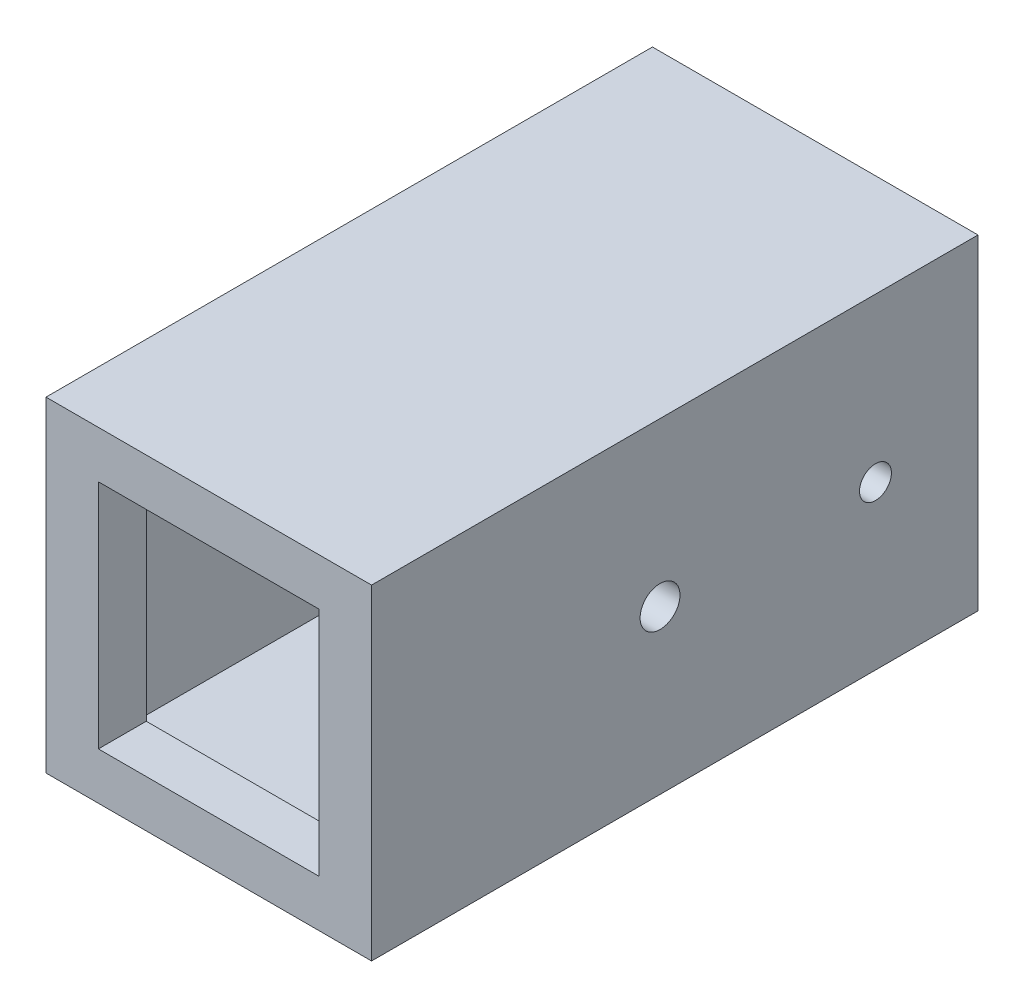
ISO-10303-21;
HEADER;
FILE_DESCRIPTION(('STEP AP214'),'2;1');
FILE_NAME('part.step','',(''),(''),'','','');
FILE_SCHEMA(('AUTOMOTIVE_DESIGN { 1 0 10303 214 1 1 1 1 }'));
ENDSEC;
DATA;
#1=APPLICATION_CONTEXT('core data for automotive mechanical design processes');
#2=APPLICATION_PROTOCOL_DEFINITION('international standard','automotive_design',2000,#1);
#3=PRODUCT_CONTEXT('',#1,'mechanical');
#4=PRODUCT('Part','Part','',(#3));
#5=PRODUCT_RELATED_PRODUCT_CATEGORY('part','',(#4));
#6=PRODUCT_DEFINITION_FORMATION('','',#4);
#7=PRODUCT_DEFINITION_CONTEXT('part definition',#1,'design');
#8=PRODUCT_DEFINITION('design','',#6,#7);
#9=PRODUCT_DEFINITION_SHAPE('','',#8);
#10=(LENGTH_UNIT() NAMED_UNIT(*) SI_UNIT(.MILLI.,.METRE.));
#11=(NAMED_UNIT(*) PLANE_ANGLE_UNIT() SI_UNIT($,.RADIAN.));
#12=(NAMED_UNIT(*) SI_UNIT($,.STERADIAN.) SOLID_ANGLE_UNIT());
#13=UNCERTAINTY_MEASURE_WITH_UNIT(LENGTH_MEASURE(1.E-05),#10,'distance_accuracy_value','');
#14=(GEOMETRIC_REPRESENTATION_CONTEXT(3) GLOBAL_UNCERTAINTY_ASSIGNED_CONTEXT((#13)) GLOBAL_UNIT_ASSIGNED_CONTEXT((#10,
#11,#12)) REPRESENTATION_CONTEXT('',''));
#15=CARTESIAN_POINT('',(0.,0.,0.));
#16=DIRECTION('',(0.,0.,1.));
#17=DIRECTION('',(1.,0.,0.));
#18=AXIS2_PLACEMENT_3D('',#15,#16,#17);
#19=CARTESIAN_POINT('',(10.2,-10.2,-35.));
#20=DIRECTION('',(1.,0.,0.));
#21=DIRECTION('',(0.,0.,-1.));
#22=AXIS2_PLACEMENT_3D('',#19,#20,#21);
#23=PLANE('',#22);
#24=CARTESIAN_POINT('',(10.2,0.,-15.075758146974));
#25=DIRECTION('',(1.,0.,0.));
#26=DIRECTION('',(0.,0.,-1.));
#27=AXIS2_PLACEMENT_3D('',#24,#25,#26);
#28=CIRCLE('',#27,1.25);
#29=CARTESIAN_POINT('',(10.2,0.,-16.325758146974));
#30=VERTEX_POINT('',#29);
#31=EDGE_CURVE('E279',#30,#30,#28,.T.);
#32=ORIENTED_EDGE('',*,*,#31,.F.);
#33=EDGE_LOOP('',(#32));
#34=FACE_BOUND('',#33,.T.);
#35=CARTESIAN_POINT('',(10.2,1.18542787272173E-13,-28.575758146974));
#36=DIRECTION('',(1.,0.,0.));
#37=DIRECTION('',(0.,0.,-1.));
#38=AXIS2_PLACEMENT_3D('',#35,#36,#37);
#39=CIRCLE('',#38,1.);
#40=CARTESIAN_POINT('',(10.2,1.18542787272173E-13,-29.575758146974));
#41=VERTEX_POINT('',#40);
#42=EDGE_CURVE('E274',#41,#41,#39,.T.);
#43=ORIENTED_EDGE('',*,*,#42,.F.);
#44=EDGE_LOOP('',(#43));
#45=FACE_BOUND('',#44,.T.);
#46=DIRECTION('',(0.,0.,1.));
#47=VECTOR('',#46,1.);
#48=CARTESIAN_POINT('',(10.2,10.2,-35.));
#49=LINE('',#48,#47);
#50=CARTESIAN_POINT('',(10.2,10.2,-35.));
#51=VERTEX_POINT('',#50);
#52=CARTESIAN_POINT('',(10.2,10.2,3.));
#53=VERTEX_POINT('',#52);
#54=EDGE_CURVE('E228',#51,#53,#49,.T.);
#55=ORIENTED_EDGE('',*,*,#54,.T.);
#56=DIRECTION('',(0.,1.,0.));
#57=VECTOR('',#56,1.);
#58=CARTESIAN_POINT('',(10.2,10.2,3.));
#59=LINE('',#58,#57);
#60=CARTESIAN_POINT('',(10.2,-10.2,3.));
#61=VERTEX_POINT('',#60);
#62=EDGE_CURVE('E159',#61,#53,#59,.T.);
#63=ORIENTED_EDGE('',*,*,#62,.F.);
#64=DIRECTION('',(0.,0.,1.));
#65=VECTOR('',#64,1.);
#66=CARTESIAN_POINT('',(10.2,-10.2,-35.));
#67=LINE('',#66,#65);
#68=CARTESIAN_POINT('',(10.2,-10.2,-35.));
#69=VERTEX_POINT('',#68);
#70=EDGE_CURVE('E229',#69,#61,#67,.T.);
#71=ORIENTED_EDGE('',*,*,#70,.F.);
#72=DIRECTION('',(0.,1.,0.));
#73=VECTOR('',#72,1.);
#74=CARTESIAN_POINT('',(10.2,-10.2,-35.));
#75=LINE('',#74,#73);
#76=EDGE_CURVE('E211',#69,#51,#75,.T.);
#77=ORIENTED_EDGE('',*,*,#76,.T.);
#78=EDGE_LOOP('',(#55,#63,#71,#77));
#79=FACE_BOUND('',#78,.T.);
#80=ADVANCED_FACE('F39',(#34,#45,#79),#23,.T.);
#81=CARTESIAN_POINT('',(-10.2,-10.2,-35.));
#82=DIRECTION('',(0.,-1.,0.));
#83=DIRECTION('',(0.,0.,-1.));
#84=AXIS2_PLACEMENT_3D('',#81,#82,#83);
#85=PLANE('',#84);
#86=ORIENTED_EDGE('',*,*,#70,.T.);
#87=DIRECTION('',(1.,0.,0.));
#88=VECTOR('',#87,1.);
#89=CARTESIAN_POINT('',(10.2,-10.2,3.));
#90=LINE('',#89,#88);
#91=CARTESIAN_POINT('',(-10.2,-10.2,3.));
#92=VERTEX_POINT('',#91);
#93=EDGE_CURVE('E193',#92,#61,#90,.T.);
#94=ORIENTED_EDGE('',*,*,#93,.F.);
#95=DIRECTION('',(0.,0.,1.));
#96=VECTOR('',#95,1.);
#97=CARTESIAN_POINT('',(-10.2,-10.2,-35.));
#98=LINE('',#97,#96);
#99=CARTESIAN_POINT('',(-10.2,-10.2,-35.));
#100=VERTEX_POINT('',#99);
#101=EDGE_CURVE('E232',#100,#92,#98,.T.);
#102=ORIENTED_EDGE('',*,*,#101,.F.);
#103=DIRECTION('',(1.,0.,0.));
#104=VECTOR('',#103,1.);
#105=CARTESIAN_POINT('',(-10.2,-10.2,-35.));
#106=LINE('',#105,#104);
#107=EDGE_CURVE('E225',#100,#69,#106,.T.);
#108=ORIENTED_EDGE('',*,*,#107,.T.);
#109=EDGE_LOOP('',(#86,#94,#102,#108));
#110=FACE_BOUND('',#109,.T.);
#111=ADVANCED_FACE('F309',(#110),#85,.T.);
#112=CARTESIAN_POINT('',(-10.2,-10.2,-35.));
#113=DIRECTION('',(-1.,0.,0.));
#114=DIRECTION('',(0.,0.,1.));
#115=AXIS2_PLACEMENT_3D('',#112,#113,#114);
#116=PLANE('',#115);
#117=CARTESIAN_POINT('',(-10.2,0.,-15.075758146974));
#118=DIRECTION('',(1.,0.,0.));
#119=DIRECTION('',(0.,0.,-1.));
#120=AXIS2_PLACEMENT_3D('',#117,#118,#119);
#121=CIRCLE('',#120,1.25);
#122=CARTESIAN_POINT('',(-10.2,0.,-16.325758146974));
#123=VERTEX_POINT('',#122);
#124=EDGE_CURVE('E241',#123,#123,#121,.T.);
#125=ORIENTED_EDGE('',*,*,#124,.T.);
#126=EDGE_LOOP('',(#125));
#127=FACE_BOUND('',#126,.T.);
#128=CARTESIAN_POINT('',(-10.2,1.18542787272173E-13,-28.575758146974));
#129=DIRECTION('',(1.,0.,0.));
#130=DIRECTION('',(0.,0.,-1.));
#131=AXIS2_PLACEMENT_3D('',#128,#129,#130);
#132=CIRCLE('',#131,1.);
#133=CARTESIAN_POINT('',(-10.2,1.18542787272173E-13,-29.575758146974));
#134=VERTEX_POINT('',#133);
#135=EDGE_CURVE('E269',#134,#134,#132,.T.);
#136=ORIENTED_EDGE('',*,*,#135,.T.);
#137=EDGE_LOOP('',(#136));
#138=FACE_BOUND('',#137,.T.);
#139=ORIENTED_EDGE('',*,*,#101,.T.);
#140=DIRECTION('',(0.,-1.,0.));
#141=VECTOR('',#140,1.);
#142=CARTESIAN_POINT('',(-10.2,10.2,3.));
#143=LINE('',#142,#141);
#144=CARTESIAN_POINT('',(-10.2,10.2,3.));
#145=VERTEX_POINT('',#144);
#146=EDGE_CURVE('E190',#145,#92,#143,.T.);
#147=ORIENTED_EDGE('',*,*,#146,.F.);
#148=DIRECTION('',(0.,0.,1.));
#149=VECTOR('',#148,1.);
#150=CARTESIAN_POINT('',(-10.2,10.2,-35.));
#151=LINE('',#150,#149);
#152=CARTESIAN_POINT('',(-10.2,10.2,-35.));
#153=VERTEX_POINT('',#152);
#154=EDGE_CURVE('E234',#153,#145,#151,.T.);
#155=ORIENTED_EDGE('',*,*,#154,.F.);
#156=DIRECTION('',(0.,-1.,0.));
#157=VECTOR('',#156,1.);
#158=CARTESIAN_POINT('',(-10.2,-10.2,-35.));
#159=LINE('',#158,#157);
#160=EDGE_CURVE('E222',#153,#100,#159,.T.);
#161=ORIENTED_EDGE('',*,*,#160,.T.);
#162=EDGE_LOOP('',(#139,#147,#155,#161));
#163=FACE_BOUND('',#162,.T.);
#164=ADVANCED_FACE('F315',(#127,#138,#163),#116,.T.);
#165=CARTESIAN_POINT('',(-10.2,10.2,-35.));
#166=DIRECTION('',(0.,1.,0.));
#167=DIRECTION('',(0.,0.,1.));
#168=AXIS2_PLACEMENT_3D('',#165,#166,#167);
#169=PLANE('',#168);
#170=ORIENTED_EDGE('',*,*,#154,.T.);
#171=DIRECTION('',(-1.,0.,0.));
#172=VECTOR('',#171,1.);
#173=CARTESIAN_POINT('',(10.2,10.2,3.));
#174=LINE('',#173,#172);
#175=EDGE_CURVE('E187',#53,#145,#174,.T.);
#176=ORIENTED_EDGE('',*,*,#175,.F.);
#177=ORIENTED_EDGE('',*,*,#54,.F.);
#178=DIRECTION('',(-1.,0.,0.));
#179=VECTOR('',#178,1.);
#180=CARTESIAN_POINT('',(-10.2,10.2,-35.));
#181=LINE('',#180,#179);
#182=EDGE_CURVE('E219',#51,#153,#181,.T.);
#183=ORIENTED_EDGE('',*,*,#182,.T.);
#184=EDGE_LOOP('',(#170,#176,#177,#183));
#185=FACE_BOUND('',#184,.T.);
#186=ADVANCED_FACE('F322',(#185),#169,.T.);
#187=CARTESIAN_POINT('',(0.,0.,-35.));
#188=DIRECTION('',(0.,0.,-1.));
#189=DIRECTION('',(-1.,0.,0.));
#190=AXIS2_PLACEMENT_3D('',#187,#188,#189);
#191=PLANE('',#190);
#192=DIRECTION('',(-1.,0.,0.));
#193=VECTOR('',#192,1.);
#194=CARTESIAN_POINT('',(-8.2,9.2,-35.));
#195=LINE('',#194,#193);
#196=CARTESIAN_POINT('',(9.2,9.2,-35.));
#197=VERTEX_POINT('',#196);
#198=CARTESIAN_POINT('',(-9.2,9.2,-35.));
#199=VERTEX_POINT('',#198);
#200=EDGE_CURVE('E231',#197,#199,#195,.T.);
#201=ORIENTED_EDGE('',*,*,#200,.T.);
#202=DIRECTION('',(0.,-1.,0.));
#203=VECTOR('',#202,1.);
#204=CARTESIAN_POINT('',(-9.2,-8.2,-35.));
#205=LINE('',#204,#203);
#206=CARTESIAN_POINT('',(-9.2,-9.2,-35.));
#207=VERTEX_POINT('',#206);
#208=EDGE_CURVE('E250',#199,#207,#205,.T.);
#209=ORIENTED_EDGE('',*,*,#208,.T.);
#210=DIRECTION('',(1.,0.,0.));
#211=VECTOR('',#210,1.);
#212=CARTESIAN_POINT('',(8.2,-9.2,-35.));
#213=LINE('',#212,#211);
#214=CARTESIAN_POINT('',(9.2,-9.2,-35.));
#215=VERTEX_POINT('',#214);
#216=EDGE_CURVE('E248',#207,#215,#213,.T.);
#217=ORIENTED_EDGE('',*,*,#216,.T.);
#218=DIRECTION('',(0.,1.,0.));
#219=VECTOR('',#218,1.);
#220=CARTESIAN_POINT('',(9.2,8.2,-35.));
#221=LINE('',#220,#219);
#222=EDGE_CURVE('E246',#215,#197,#221,.T.);
#223=ORIENTED_EDGE('',*,*,#222,.T.);
#224=EDGE_LOOP('',(#201,#209,#217,#223));
#225=FACE_BOUND('',#224,.T.);
#226=ORIENTED_EDGE('',*,*,#76,.F.);
#227=ORIENTED_EDGE('',*,*,#107,.F.);
#228=ORIENTED_EDGE('',*,*,#160,.F.);
#229=ORIENTED_EDGE('',*,*,#182,.F.);
#230=EDGE_LOOP('',(#226,#227,#228,#229));
#231=FACE_BOUND('',#230,.T.);
#232=ADVANCED_FACE('F465',(#225,#231),#191,.T.);
#233=CARTESIAN_POINT('',(8.2,-8.2,-35.));
#234=DIRECTION('',(1.,0.,0.));
#235=DIRECTION('',(0.,0.,-1.));
#236=AXIS2_PLACEMENT_3D('',#233,#234,#235);
#237=PLANE('',#236);
#238=CARTESIAN_POINT('',(8.19999999999999,0.,-15.075758146974));
#239=DIRECTION('',(1.,0.,0.));
#240=DIRECTION('',(0.,0.,-1.));
#241=AXIS2_PLACEMENT_3D('',#238,#239,#240);
#242=CIRCLE('',#241,1.25);
#243=CARTESIAN_POINT('',(8.19999999999999,0.,-16.325758146974));
#244=VERTEX_POINT('',#243);
#245=EDGE_CURVE('E174',#244,#244,#242,.T.);
#246=ORIENTED_EDGE('',*,*,#245,.T.);
#247=EDGE_LOOP('',(#246));
#248=FACE_BOUND('',#247,.T.);
#249=CARTESIAN_POINT('',(8.19999999999999,1.18542787272173E-13,-28.575758146974));
#250=DIRECTION('',(1.,0.,0.));
#251=DIRECTION('',(0.,0.,-1.));
#252=AXIS2_PLACEMENT_3D('',#249,#250,#251);
#253=CIRCLE('',#252,1.);
#254=CARTESIAN_POINT('',(8.19999999999999,1.18542787272173E-13,-29.575758146974));
#255=VERTEX_POINT('',#254);
#256=EDGE_CURVE('E240',#255,#255,#253,.T.);
#257=ORIENTED_EDGE('',*,*,#256,.T.);
#258=EDGE_LOOP('',(#257));
#259=FACE_BOUND('',#258,.T.);
#260=DIRECTION('',(0.,0.,1.));
#261=VECTOR('',#260,1.);
#262=CARTESIAN_POINT('',(8.2,8.2,-35.));
#263=LINE('',#262,#261);
#264=CARTESIAN_POINT('',(8.2,8.2,-34.));
#265=VERTEX_POINT('',#264);
#266=CARTESIAN_POINT('',(8.2,8.2,0.));
#267=VERTEX_POINT('',#266);
#268=EDGE_CURVE('E208',#265,#267,#263,.T.);
#269=ORIENTED_EDGE('',*,*,#268,.F.);
#270=DIRECTION('',(0.,1.,0.));
#271=VECTOR('',#270,1.);
#272=CARTESIAN_POINT('',(8.2,-8.2,-34.));
#273=LINE('',#272,#271);
#274=CARTESIAN_POINT('',(8.2,-8.2,-34.));
#275=VERTEX_POINT('',#274);
#276=EDGE_CURVE('E48',#265,#275,#273,.F.);
#277=ORIENTED_EDGE('',*,*,#276,.T.);
#278=DIRECTION('',(0.,0.,1.));
#279=VECTOR('',#278,1.);
#280=CARTESIAN_POINT('',(8.2,-8.2,-35.));
#281=LINE('',#280,#279);
#282=CARTESIAN_POINT('',(8.2,-8.2,0.));
#283=VERTEX_POINT('',#282);
#284=EDGE_CURVE('E209',#275,#283,#281,.T.);
#285=ORIENTED_EDGE('',*,*,#284,.T.);
#286=DIRECTION('',(0.,1.,0.));
#287=VECTOR('',#286,1.);
#288=CARTESIAN_POINT('',(8.2,-8.2,0.));
#289=LINE('',#288,#287);
#290=EDGE_CURVE('E196',#283,#267,#289,.T.);
#291=ORIENTED_EDGE('',*,*,#290,.T.);
#292=EDGE_LOOP('',(#269,#277,#285,#291));
#293=FACE_BOUND('',#292,.T.);
#294=ADVANCED_FACE('F287',(#248,#259,#293),#237,.F.);
#295=CARTESIAN_POINT('',(-8.2,-8.2,-35.));
#296=DIRECTION('',(0.,-1.,0.));
#297=DIRECTION('',(0.,0.,-1.));
#298=AXIS2_PLACEMENT_3D('',#295,#296,#297);
#299=PLANE('',#298);
#300=ORIENTED_EDGE('',*,*,#284,.F.);
#301=DIRECTION('',(1.,0.,0.));
#302=VECTOR('',#301,1.);
#303=CARTESIAN_POINT('',(-8.2,-8.2,-34.));
#304=LINE('',#303,#302);
#305=CARTESIAN_POINT('',(-8.2,-8.2,-34.));
#306=VERTEX_POINT('',#305);
#307=EDGE_CURVE('E256',#275,#306,#304,.F.);
#308=ORIENTED_EDGE('',*,*,#307,.T.);
#309=DIRECTION('',(0.,0.,1.));
#310=VECTOR('',#309,1.);
#311=CARTESIAN_POINT('',(-8.2,-8.2,-35.));
#312=LINE('',#311,#310);
#313=CARTESIAN_POINT('',(-8.2,-8.2,0.));
#314=VERTEX_POINT('',#313);
#315=EDGE_CURVE('E212',#306,#314,#312,.T.);
#316=ORIENTED_EDGE('',*,*,#315,.T.);
#317=DIRECTION('',(1.,0.,0.));
#318=VECTOR('',#317,1.);
#319=CARTESIAN_POINT('',(-8.2,-8.2,0.));
#320=LINE('',#319,#318);
#321=EDGE_CURVE('E205',#314,#283,#320,.T.);
#322=ORIENTED_EDGE('',*,*,#321,.T.);
#323=EDGE_LOOP('',(#300,#308,#316,#322));
#324=FACE_BOUND('',#323,.T.);
#325=ADVANCED_FACE('F513',(#324),#299,.F.);
#326=CARTESIAN_POINT('',(-8.2,-8.2,-35.));
#327=DIRECTION('',(-1.,0.,0.));
#328=DIRECTION('',(0.,0.,1.));
#329=AXIS2_PLACEMENT_3D('',#326,#327,#328);
#330=PLANE('',#329);
#331=CARTESIAN_POINT('',(-8.2,0.,-15.075758146974));
#332=DIRECTION('',(-1.,0.,0.));
#333=DIRECTION('',(0.,0.,1.));
#334=AXIS2_PLACEMENT_3D('',#331,#332,#333);
#335=CIRCLE('',#334,1.25);
#336=CARTESIAN_POINT('',(-8.2,0.,-13.825758146974));
#337=VERTEX_POINT('',#336);
#338=EDGE_CURVE('E242',#337,#337,#335,.T.);
#339=ORIENTED_EDGE('',*,*,#338,.T.);
#340=EDGE_LOOP('',(#339));
#341=FACE_BOUND('',#340,.T.);
#342=CARTESIAN_POINT('',(-8.2,1.18542787272173E-13,-28.575758146974));
#343=DIRECTION('',(-1.,0.,0.));
#344=DIRECTION('',(0.,0.,1.));
#345=AXIS2_PLACEMENT_3D('',#342,#343,#344);
#346=CIRCLE('',#345,1.);
#347=CARTESIAN_POINT('',(-8.2,1.18542787272173E-13,-27.575758146974));
#348=VERTEX_POINT('',#347);
#349=EDGE_CURVE('E237',#348,#348,#346,.T.);
#350=ORIENTED_EDGE('',*,*,#349,.T.);
#351=EDGE_LOOP('',(#350));
#352=FACE_BOUND('',#351,.T.);
#353=ORIENTED_EDGE('',*,*,#315,.F.);
#354=DIRECTION('',(0.,-1.,0.));
#355=VECTOR('',#354,1.);
#356=CARTESIAN_POINT('',(-8.2,8.2,-34.));
#357=LINE('',#356,#355);
#358=CARTESIAN_POINT('',(-8.2,8.2,-34.));
#359=VERTEX_POINT('',#358);
#360=EDGE_CURVE('E253',#306,#359,#357,.F.);
#361=ORIENTED_EDGE('',*,*,#360,.T.);
#362=DIRECTION('',(0.,0.,1.));
#363=VECTOR('',#362,1.);
#364=CARTESIAN_POINT('',(-8.2,8.2,-35.));
#365=LINE('',#364,#363);
#366=CARTESIAN_POINT('',(-8.2,8.2,0.));
#367=VERTEX_POINT('',#366);
#368=EDGE_CURVE('E214',#359,#367,#365,.T.);
#369=ORIENTED_EDGE('',*,*,#368,.T.);
#370=DIRECTION('',(0.,-1.,0.));
#371=VECTOR('',#370,1.);
#372=CARTESIAN_POINT('',(-8.2,-8.2,0.));
#373=LINE('',#372,#371);
#374=EDGE_CURVE('E202',#367,#314,#373,.T.);
#375=ORIENTED_EDGE('',*,*,#374,.T.);
#376=EDGE_LOOP('',(#353,#361,#369,#375));
#377=FACE_BOUND('',#376,.T.);
#378=ADVANCED_FACE('F503',(#341,#352,#377),#330,.F.);
#379=CARTESIAN_POINT('',(-8.2,8.2,-35.));
#380=DIRECTION('',(0.,1.,0.));
#381=DIRECTION('',(0.,0.,1.));
#382=AXIS2_PLACEMENT_3D('',#379,#380,#381);
#383=PLANE('',#382);
#384=ORIENTED_EDGE('',*,*,#368,.F.);
#385=DIRECTION('',(-1.,0.,0.));
#386=VECTOR('',#385,1.);
#387=CARTESIAN_POINT('',(8.2,8.2,-34.));
#388=LINE('',#387,#386);
#389=EDGE_CURVE('E11',#359,#265,#388,.F.);
#390=ORIENTED_EDGE('',*,*,#389,.T.);
#391=ORIENTED_EDGE('',*,*,#268,.T.);
#392=DIRECTION('',(-1.,0.,0.));
#393=VECTOR('',#392,1.);
#394=CARTESIAN_POINT('',(-8.2,8.2,0.));
#395=LINE('',#394,#393);
#396=EDGE_CURVE('E199',#267,#367,#395,.T.);
#397=ORIENTED_EDGE('',*,*,#396,.T.);
#398=EDGE_LOOP('',(#384,#390,#391,#397));
#399=FACE_BOUND('',#398,.T.);
#400=ADVANCED_FACE('F453',(#399),#383,.F.);
#401=CARTESIAN_POINT('',(0.,0.,0.));
#402=DIRECTION('',(0.,0.,-1.));
#403=DIRECTION('',(-1.,0.,0.));
#404=AXIS2_PLACEMENT_3D('',#401,#402,#403);
#405=PLANE('',#404);
#406=DIRECTION('',(-1.,0.,0.));
#407=VECTOR('',#406,1.);
#408=CARTESIAN_POINT('',(6.9173511930245,7.24862700945783,0.));
#409=LINE('',#408,#407);
#410=CARTESIAN_POINT('',(6.9173511930245,7.24862700945783,0.));
#411=VERTEX_POINT('',#410);
#412=CARTESIAN_POINT('',(-6.9173511930245,7.24862700945783,0.));
#413=VERTEX_POINT('',#412);
#414=EDGE_CURVE('E152',#411,#413,#409,.T.);
#415=ORIENTED_EDGE('',*,*,#414,.T.);
#416=DIRECTION('',(0.,-1.,0.));
#417=VECTOR('',#416,1.);
#418=CARTESIAN_POINT('',(-6.9173511930245,-7.24862700945783,0.));
#419=LINE('',#418,#417);
#420=CARTESIAN_POINT('',(-6.9173511930245,-7.24862700945783,0.));
#421=VERTEX_POINT('',#420);
#422=EDGE_CURVE('E172',#413,#421,#419,.T.);
#423=ORIENTED_EDGE('',*,*,#422,.T.);
#424=DIRECTION('',(1.,0.,0.));
#425=VECTOR('',#424,1.);
#426=CARTESIAN_POINT('',(6.9173511930245,-7.24862700945783,0.));
#427=LINE('',#426,#425);
#428=CARTESIAN_POINT('',(6.9173511930245,-7.24862700945783,0.));
#429=VERTEX_POINT('',#428);
#430=EDGE_CURVE('E158',#421,#429,#427,.T.);
#431=ORIENTED_EDGE('',*,*,#430,.T.);
#432=DIRECTION('',(0.,1.,0.));
#433=VECTOR('',#432,1.);
#434=CARTESIAN_POINT('',(6.9173511930245,-7.24862700945783,0.));
#435=LINE('',#434,#433);
#436=EDGE_CURVE('E176',#429,#411,#435,.T.);
#437=ORIENTED_EDGE('',*,*,#436,.T.);
#438=EDGE_LOOP('',(#415,#423,#431,#437));
#439=FACE_BOUND('',#438,.T.);
#440=ORIENTED_EDGE('',*,*,#396,.F.);
#441=ORIENTED_EDGE('',*,*,#290,.F.);
#442=ORIENTED_EDGE('',*,*,#321,.F.);
#443=ORIENTED_EDGE('',*,*,#374,.F.);
#444=EDGE_LOOP('',(#440,#441,#442,#443));
#445=FACE_BOUND('',#444,.T.);
#446=ADVANCED_FACE('F442',(#439,#445),#405,.T.);
#447=CARTESIAN_POINT('',(0.,0.,3.));
#448=DIRECTION('',(0.,0.,-1.));
#449=DIRECTION('',(-1.,0.,0.));
#450=AXIS2_PLACEMENT_3D('',#447,#448,#449);
#451=PLANE('',#450);
#452=ORIENTED_EDGE('',*,*,#62,.T.);
#453=ORIENTED_EDGE('',*,*,#175,.T.);
#454=ORIENTED_EDGE('',*,*,#146,.T.);
#455=ORIENTED_EDGE('',*,*,#93,.T.);
#456=EDGE_LOOP('',(#452,#453,#454,#455));
#457=FACE_BOUND('',#456,.T.);
#458=DIRECTION('',(0.,-1.,0.));
#459=VECTOR('',#458,1.);
#460=CARTESIAN_POINT('',(-6.9173511930245,-7.24862700945783,3.));
#461=LINE('',#460,#459);
#462=CARTESIAN_POINT('',(-6.9173511930245,7.24862700945783,3.));
#463=VERTEX_POINT('',#462);
#464=CARTESIAN_POINT('',(-6.9173511930245,-7.24862700945783,3.));
#465=VERTEX_POINT('',#464);
#466=EDGE_CURVE('E141',#463,#465,#461,.T.);
#467=ORIENTED_EDGE('',*,*,#466,.F.);
#468=DIRECTION('',(-1.,0.,0.));
#469=VECTOR('',#468,1.);
#470=CARTESIAN_POINT('',(6.9173511930245,7.24862700945783,3.));
#471=LINE('',#470,#469);
#472=CARTESIAN_POINT('',(6.9173511930245,7.24862700945783,3.));
#473=VERTEX_POINT('',#472);
#474=EDGE_CURVE('E167',#473,#463,#471,.T.);
#475=ORIENTED_EDGE('',*,*,#474,.F.);
#476=DIRECTION('',(0.,1.,0.));
#477=VECTOR('',#476,1.);
#478=CARTESIAN_POINT('',(6.9173511930245,-7.24862700945783,3.));
#479=LINE('',#478,#477);
#480=CARTESIAN_POINT('',(6.9173511930245,-7.24862700945783,3.));
#481=VERTEX_POINT('',#480);
#482=EDGE_CURVE('E165',#481,#473,#479,.T.);
#483=ORIENTED_EDGE('',*,*,#482,.F.);
#484=DIRECTION('',(1.,0.,0.));
#485=VECTOR('',#484,1.);
#486=CARTESIAN_POINT('',(6.9173511930245,-7.24862700945783,3.));
#487=LINE('',#486,#485);
#488=EDGE_CURVE('E151',#465,#481,#487,.T.);
#489=ORIENTED_EDGE('',*,*,#488,.F.);
#490=EDGE_LOOP('',(#467,#475,#483,#489));
#491=FACE_BOUND('',#490,.T.);
#492=ADVANCED_FACE('F163',(#457,#491),#451,.F.);
#493=CARTESIAN_POINT('',(-6.9173511930245,-7.24862700945783,3.));
#494=DIRECTION('',(1.,0.,0.));
#495=DIRECTION('',(0.,0.,-1.));
#496=AXIS2_PLACEMENT_3D('',#493,#494,#495);
#497=PLANE('',#496);
#498=ORIENTED_EDGE('',*,*,#422,.F.);
#499=DIRECTION('',(0.,0.,-1.));
#500=VECTOR('',#499,1.);
#501=CARTESIAN_POINT('',(-6.9173511930245,7.24862700945783,3.));
#502=LINE('',#501,#500);
#503=EDGE_CURVE('E147',#463,#413,#502,.T.);
#504=ORIENTED_EDGE('',*,*,#503,.F.);
#505=ORIENTED_EDGE('',*,*,#466,.T.);
#506=DIRECTION('',(0.,0.,-1.));
#507=VECTOR('',#506,1.);
#508=CARTESIAN_POINT('',(-6.9173511930245,-7.24862700945783,3.));
#509=LINE('',#508,#507);
#510=EDGE_CURVE('E144',#465,#421,#509,.T.);
#511=ORIENTED_EDGE('',*,*,#510,.T.);
#512=EDGE_LOOP('',(#498,#504,#505,#511));
#513=FACE_BOUND('',#512,.T.);
#514=ADVANCED_FACE('F143',(#513),#497,.T.);
#515=CARTESIAN_POINT('',(6.9173511930245,-7.24862700945783,3.));
#516=DIRECTION('',(0.,1.,0.));
#517=DIRECTION('',(0.,0.,1.));
#518=AXIS2_PLACEMENT_3D('',#515,#516,#517);
#519=PLANE('',#518);
#520=ORIENTED_EDGE('',*,*,#430,.F.);
#521=ORIENTED_EDGE('',*,*,#510,.F.);
#522=ORIENTED_EDGE('',*,*,#488,.T.);
#523=DIRECTION('',(0.,0.,-1.));
#524=VECTOR('',#523,1.);
#525=CARTESIAN_POINT('',(6.9173511930245,-7.24862700945783,3.));
#526=LINE('',#525,#524);
#527=EDGE_CURVE('E160',#481,#429,#526,.T.);
#528=ORIENTED_EDGE('',*,*,#527,.T.);
#529=EDGE_LOOP('',(#520,#521,#522,#528));
#530=FACE_BOUND('',#529,.T.);
#531=ADVANCED_FACE('F155',(#530),#519,.T.);
#532=CARTESIAN_POINT('',(6.9173511930245,-7.24862700945783,3.));
#533=DIRECTION('',(-1.,0.,0.));
#534=DIRECTION('',(0.,0.,1.));
#535=AXIS2_PLACEMENT_3D('',#532,#533,#534);
#536=PLANE('',#535);
#537=ORIENTED_EDGE('',*,*,#436,.F.);
#538=ORIENTED_EDGE('',*,*,#527,.F.);
#539=ORIENTED_EDGE('',*,*,#482,.T.);
#540=DIRECTION('',(0.,0.,-1.));
#541=VECTOR('',#540,1.);
#542=CARTESIAN_POINT('',(6.9173511930245,7.24862700945783,3.));
#543=LINE('',#542,#541);
#544=EDGE_CURVE('E182',#473,#411,#543,.T.);
#545=ORIENTED_EDGE('',*,*,#544,.T.);
#546=EDGE_LOOP('',(#537,#538,#539,#545));
#547=FACE_BOUND('',#546,.T.);
#548=ADVANCED_FACE('F403',(#547),#536,.T.);
#549=CARTESIAN_POINT('',(6.9173511930245,7.24862700945783,3.));
#550=DIRECTION('',(0.,-1.,0.));
#551=DIRECTION('',(0.,0.,-1.));
#552=AXIS2_PLACEMENT_3D('',#549,#550,#551);
#553=PLANE('',#552);
#554=ORIENTED_EDGE('',*,*,#414,.F.);
#555=ORIENTED_EDGE('',*,*,#544,.F.);
#556=ORIENTED_EDGE('',*,*,#474,.T.);
#557=ORIENTED_EDGE('',*,*,#503,.T.);
#558=EDGE_LOOP('',(#554,#555,#556,#557));
#559=FACE_BOUND('',#558,.T.);
#560=ADVANCED_FACE('F392',(#559),#553,.T.);
#561=CARTESIAN_POINT('',(-10.2,1.18542787272173E-13,-28.575758146974));
#562=DIRECTION('',(1.,0.,0.));
#563=DIRECTION('',(0.,0.,-1.));
#564=AXIS2_PLACEMENT_3D('',#561,#562,#563);
#565=CYLINDRICAL_SURFACE('',#564,1.);
#566=ORIENTED_EDGE('',*,*,#135,.F.);
#567=EDGE_LOOP('',(#566));
#568=FACE_BOUND('',#567,.T.);
#569=ORIENTED_EDGE('',*,*,#349,.F.);
#570=EDGE_LOOP('',(#569));
#571=FACE_BOUND('',#570,.T.);
#572=ADVANCED_FACE('F304',(#568,#571),#565,.F.);
#573=CARTESIAN_POINT('',(-10.2,0.,-15.075758146974));
#574=DIRECTION('',(1.,0.,0.));
#575=DIRECTION('',(0.,0.,-1.));
#576=AXIS2_PLACEMENT_3D('',#573,#574,#575);
#577=CYLINDRICAL_SURFACE('',#576,1.25);
#578=ORIENTED_EDGE('',*,*,#124,.F.);
#579=EDGE_LOOP('',(#578));
#580=FACE_BOUND('',#579,.T.);
#581=ORIENTED_EDGE('',*,*,#338,.F.);
#582=EDGE_LOOP('',(#581));
#583=FACE_BOUND('',#582,.T.);
#584=ADVANCED_FACE('F295',(#580,#583),#577,.F.);
#585=ORIENTED_EDGE('',*,*,#42,.T.);
#586=EDGE_LOOP('',(#585));
#587=FACE_BOUND('',#586,.T.);
#588=ORIENTED_EDGE('',*,*,#256,.F.);
#589=EDGE_LOOP('',(#588));
#590=FACE_BOUND('',#589,.T.);
#591=ADVANCED_FACE('F292',(#587,#590),#565,.F.);
#592=ORIENTED_EDGE('',*,*,#31,.T.);
#593=EDGE_LOOP('',(#592));
#594=FACE_BOUND('',#593,.T.);
#595=ORIENTED_EDGE('',*,*,#245,.F.);
#596=EDGE_LOOP('',(#595));
#597=FACE_BOUND('',#596,.T.);
#598=ADVANCED_FACE('F290',(#594,#597),#577,.F.);
#599=CARTESIAN_POINT('',(9.2,0.,-34.));
#600=DIRECTION('',(0.,-1.,0.));
#601=DIRECTION('',(0.,0.,-1.));
#602=AXIS2_PLACEMENT_3D('',#599,#600,#601);
#603=CYLINDRICAL_SURFACE('',#602,1.);
#604=CARTESIAN_POINT('',(9.2,-9.2,-34.));
#605=DIRECTION('',(-0.707106781186547,-0.707106781186547,0.));
#606=DIRECTION('',(-0.707106781186547,0.707106781186547,0.));
#607=AXIS2_PLACEMENT_3D('',#604,#605,#606);
#608=ELLIPSE('',#607,1.41421356237309,1.);
#609=EDGE_CURVE('E262',#275,#215,#608,.T.);
#610=ORIENTED_EDGE('',*,*,#609,.F.);
#611=ORIENTED_EDGE('',*,*,#276,.F.);
#612=CARTESIAN_POINT('',(9.2,9.2,-34.));
#613=DIRECTION('',(0.707106781186547,-0.707106781186547,0.));
#614=DIRECTION('',(-0.707106781186547,-0.707106781186547,0.));
#615=AXIS2_PLACEMENT_3D('',#612,#613,#614);
#616=ELLIPSE('',#615,1.41421356237309,1.);
#617=EDGE_CURVE('E43',#197,#265,#616,.F.);
#618=ORIENTED_EDGE('',*,*,#617,.F.);
#619=ORIENTED_EDGE('',*,*,#222,.F.);
#620=EDGE_LOOP('',(#610,#611,#618,#619));
#621=FACE_BOUND('',#620,.T.);
#622=ADVANCED_FACE('F41',(#621),#603,.T.);
#623=CARTESIAN_POINT('',(0.,9.2,-34.));
#624=DIRECTION('',(1.,0.,0.));
#625=DIRECTION('',(0.,0.,-1.));
#626=AXIS2_PLACEMENT_3D('',#623,#624,#625);
#627=CYLINDRICAL_SURFACE('',#626,1.);
#628=ORIENTED_EDGE('',*,*,#617,.T.);
#629=ORIENTED_EDGE('',*,*,#389,.F.);
#630=CARTESIAN_POINT('',(-9.2,9.2,-34.));
#631=DIRECTION('',(0.707106781186547,0.707106781186547,0.));
#632=DIRECTION('',(-0.707106781186547,0.707106781186547,0.));
#633=AXIS2_PLACEMENT_3D('',#630,#631,#632);
#634=ELLIPSE('',#633,1.41421356237309,1.);
#635=EDGE_CURVE('E261',#199,#359,#634,.F.);
#636=ORIENTED_EDGE('',*,*,#635,.F.);
#637=ORIENTED_EDGE('',*,*,#200,.F.);
#638=EDGE_LOOP('',(#628,#629,#636,#637));
#639=FACE_BOUND('',#638,.T.);
#640=ADVANCED_FACE('F300',(#639),#627,.T.);
#641=CARTESIAN_POINT('',(0.,-9.2,-34.));
#642=DIRECTION('',(-1.,0.,0.));
#643=DIRECTION('',(0.,0.,1.));
#644=AXIS2_PLACEMENT_3D('',#641,#642,#643);
#645=CYLINDRICAL_SURFACE('',#644,1.);
#646=ORIENTED_EDGE('',*,*,#609,.T.);
#647=ORIENTED_EDGE('',*,*,#216,.F.);
#648=CARTESIAN_POINT('',(-9.2,-9.2,-34.));
#649=DIRECTION('',(-0.707106781186547,0.707106781186547,0.));
#650=DIRECTION('',(0.707106781186547,0.707106781186547,0.));
#651=AXIS2_PLACEMENT_3D('',#648,#649,#650);
#652=ELLIPSE('',#651,1.41421356237309,1.);
#653=EDGE_CURVE('E259',#306,#207,#652,.T.);
#654=ORIENTED_EDGE('',*,*,#653,.F.);
#655=ORIENTED_EDGE('',*,*,#307,.F.);
#656=EDGE_LOOP('',(#646,#647,#654,#655));
#657=FACE_BOUND('',#656,.T.);
#658=ADVANCED_FACE('F327',(#657),#645,.T.);
#659=CARTESIAN_POINT('',(-9.2,0.,-34.));
#660=DIRECTION('',(0.,1.,0.));
#661=DIRECTION('',(0.,0.,1.));
#662=AXIS2_PLACEMENT_3D('',#659,#660,#661);
#663=CYLINDRICAL_SURFACE('',#662,1.);
#664=ORIENTED_EDGE('',*,*,#635,.T.);
#665=ORIENTED_EDGE('',*,*,#360,.F.);
#666=ORIENTED_EDGE('',*,*,#653,.T.);
#667=ORIENTED_EDGE('',*,*,#208,.F.);
#668=EDGE_LOOP('',(#664,#665,#666,#667));
#669=FACE_BOUND('',#668,.T.);
#670=ADVANCED_FACE('F324',(#669),#663,.T.);
#671=CLOSED_SHELL('',(#80,#111,#164,#186,#232,#294,#325,#378,#400,#446,#492,#514,#531,#548,#560,
#572,#584,#591,#598,#622,#640,#658,#670));
#672=MANIFOLD_SOLID_BREP('B2',#671);
#673=ADVANCED_BREP_SHAPE_REPRESENTATION('',(#18,#672),#14);
#674=SHAPE_DEFINITION_REPRESENTATION(#9,#673);
ENDSEC;
END-ISO-10303-21;
